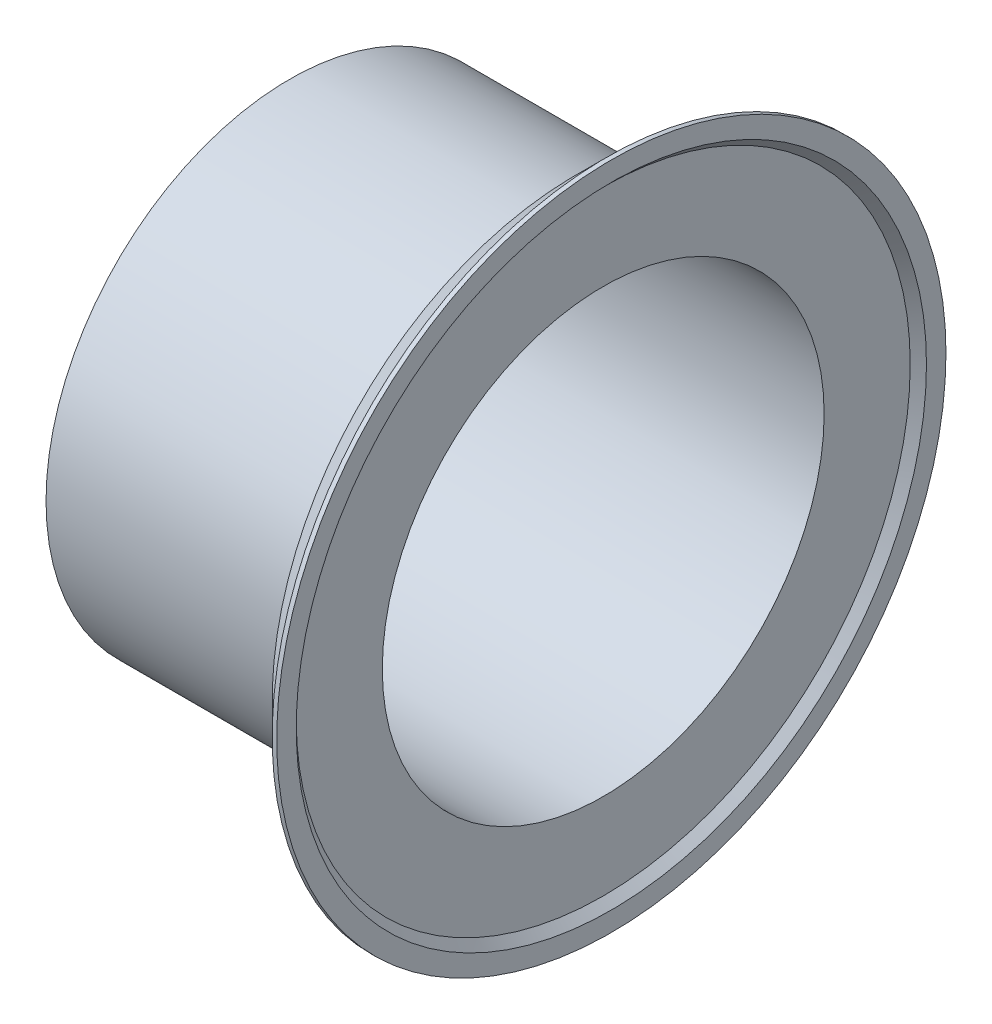
ISO-10303-21;
HEADER;
FILE_DESCRIPTION(('STEP AP214'),'2;1');
FILE_NAME('part.step','',(''),(''),'','','');
FILE_SCHEMA(('AUTOMOTIVE_DESIGN { 1 0 10303 214 1 1 1 1 }'));
ENDSEC;
DATA;
#1=APPLICATION_CONTEXT('core data for automotive mechanical design processes');
#2=APPLICATION_PROTOCOL_DEFINITION('international standard','automotive_design',2000,#1);
#3=PRODUCT_CONTEXT('',#1,'mechanical');
#4=PRODUCT('Part','Part','',(#3));
#5=PRODUCT_RELATED_PRODUCT_CATEGORY('part','',(#4));
#6=PRODUCT_DEFINITION_FORMATION('','',#4);
#7=PRODUCT_DEFINITION_CONTEXT('part definition',#1,'design');
#8=PRODUCT_DEFINITION('design','',#6,#7);
#9=PRODUCT_DEFINITION_SHAPE('','',#8);
#10=(LENGTH_UNIT() NAMED_UNIT(*) SI_UNIT(.MILLI.,.METRE.));
#11=(NAMED_UNIT(*) PLANE_ANGLE_UNIT() SI_UNIT($,.RADIAN.));
#12=(NAMED_UNIT(*) SI_UNIT($,.STERADIAN.) SOLID_ANGLE_UNIT());
#13=UNCERTAINTY_MEASURE_WITH_UNIT(LENGTH_MEASURE(1.E-05),#10,'distance_accuracy_value','');
#14=(GEOMETRIC_REPRESENTATION_CONTEXT(3) GLOBAL_UNCERTAINTY_ASSIGNED_CONTEXT((#13)) GLOBAL_UNIT_ASSIGNED_CONTEXT((#10,
#11,#12)) REPRESENTATION_CONTEXT('',''));
#15=CARTESIAN_POINT('',(0.,0.,0.));
#16=DIRECTION('',(0.,0.,1.));
#17=DIRECTION('',(1.,0.,0.));
#18=AXIS2_PLACEMENT_3D('',#15,#16,#17);
#19=CARTESIAN_POINT('',(63.1952,0.,0.));
#20=DIRECTION('',(1.,0.,0.));
#21=DIRECTION('',(0.,0.,-1.));
#22=AXIS2_PLACEMENT_3D('',#19,#20,#21);
#23=CONICAL_SURFACE('',#22,13.081,0.78539816339744);
#24=CARTESIAN_POINT('',(61.976,0.,0.));
#25=DIRECTION('',(1.,0.,0.));
#26=DIRECTION('',(0.,0.,-1.));
#27=AXIS2_PLACEMENT_3D('',#24,#25,#26);
#28=CIRCLE('',#27,11.8618);
#29=CARTESIAN_POINT('',(61.976,0.,-11.8618));
#30=VERTEX_POINT('',#29);
#31=EDGE_CURVE('E11',#30,#30,#28,.T.);
#32=ORIENTED_EDGE('',*,*,#31,.T.);
#33=EDGE_LOOP('',(#32));
#34=FACE_BOUND('',#33,.T.);
#35=CARTESIAN_POINT('',(63.1952,0.,0.));
#36=DIRECTION('',(1.,0.,0.));
#37=DIRECTION('',(0.,0.,-1.));
#38=AXIS2_PLACEMENT_3D('',#35,#36,#37);
#39=CIRCLE('',#38,13.081);
#40=CARTESIAN_POINT('',(63.1952,0.,-13.081));
#41=VERTEX_POINT('',#40);
#42=EDGE_CURVE('E73',#41,#41,#39,.T.);
#43=ORIENTED_EDGE('',*,*,#42,.F.);
#44=EDGE_LOOP('',(#43));
#45=FACE_BOUND('',#44,.T.);
#46=ADVANCED_FACE('F16',(#34,#45),#23,.T.);
#47=CARTESIAN_POINT('',(61.976,10.287,0.));
#48=DIRECTION('',(-1.,0.,0.));
#49=DIRECTION('',(0.,1.,0.));
#50=AXIS2_PLACEMENT_3D('',#47,#48,#49);
#51=PLANE('',#50);
#52=CARTESIAN_POINT('',(61.976,0.,0.));
#53=DIRECTION('',(1.,0.,0.));
#54=DIRECTION('',(0.,0.,-1.));
#55=AXIS2_PLACEMENT_3D('',#52,#53,#54);
#56=CIRCLE('',#55,10.287);
#57=CARTESIAN_POINT('',(61.976,0.,-10.287));
#58=VERTEX_POINT('',#57);
#59=EDGE_CURVE('E68',#58,#58,#56,.T.);
#60=ORIENTED_EDGE('',*,*,#59,.T.);
#61=EDGE_LOOP('',(#60));
#62=FACE_BOUND('',#61,.T.);
#63=ORIENTED_EDGE('',*,*,#31,.F.);
#64=EDGE_LOOP('',(#63));
#65=FACE_BOUND('',#64,.T.);
#66=ADVANCED_FACE('F69',(#62,#65),#51,.T.);
#67=CARTESIAN_POINT('',(63.373,13.081,0.));
#68=DIRECTION('',(1.,0.,0.));
#69=DIRECTION('',(0.,0.,1.));
#70=AXIS2_PLACEMENT_3D('',#67,#68,#69);
#71=PLANE('',#70);
#72=CARTESIAN_POINT('',(63.373,0.,0.));
#73=DIRECTION('',(1.,0.,0.));
#74=DIRECTION('',(0.,0.,-1.));
#75=AXIS2_PLACEMENT_3D('',#72,#73,#74);
#76=CIRCLE('',#75,12.319);
#77=CARTESIAN_POINT('',(63.373,0.,-12.319));
#78=VERTEX_POINT('',#77);
#79=EDGE_CURVE('E88',#78,#78,#76,.T.);
#80=ORIENTED_EDGE('',*,*,#79,.F.);
#81=EDGE_LOOP('',(#80));
#82=FACE_BOUND('',#81,.T.);
#83=CARTESIAN_POINT('',(63.373,0.,0.));
#84=DIRECTION('',(1.,0.,0.));
#85=DIRECTION('',(0.,0.,-1.));
#86=AXIS2_PLACEMENT_3D('',#83,#84,#85);
#87=CIRCLE('',#86,13.081);
#88=CARTESIAN_POINT('',(63.373,0.,-13.081));
#89=VERTEX_POINT('',#88);
#90=EDGE_CURVE('E24',#89,#89,#87,.T.);
#91=ORIENTED_EDGE('',*,*,#90,.T.);
#92=EDGE_LOOP('',(#91));
#93=FACE_BOUND('',#92,.T.);
#94=ADVANCED_FACE('F105',(#82,#93),#71,.T.);
#95=CARTESIAN_POINT('',(63.0555,12.0015,0.));
#96=DIRECTION('',(1.,0.,0.));
#97=DIRECTION('',(0.,0.,1.));
#98=AXIS2_PLACEMENT_3D('',#95,#96,#97);
#99=PLANE('',#98);
#100=CARTESIAN_POINT('',(63.0555,0.,0.));
#101=DIRECTION('',(1.,0.,0.));
#102=DIRECTION('',(0.,0.,-1.));
#103=AXIS2_PLACEMENT_3D('',#100,#101,#102);
#104=CIRCLE('',#103,8.636);
#105=CARTESIAN_POINT('',(63.0555,0.,-8.636));
#106=VERTEX_POINT('',#105);
#107=EDGE_CURVE('E140',#106,#106,#104,.T.);
#108=ORIENTED_EDGE('',*,*,#107,.F.);
#109=EDGE_LOOP('',(#108));
#110=FACE_BOUND('',#109,.T.);
#111=CARTESIAN_POINT('',(63.0555,0.,0.));
#112=DIRECTION('',(1.,0.,0.));
#113=DIRECTION('',(0.,0.,-1.));
#114=AXIS2_PLACEMENT_3D('',#111,#112,#113);
#115=CIRCLE('',#114,12.0015);
#116=CARTESIAN_POINT('',(63.0555,0.,-12.0015));
#117=VERTEX_POINT('',#116);
#118=EDGE_CURVE('E82',#117,#117,#115,.T.);
#119=ORIENTED_EDGE('',*,*,#118,.T.);
#120=EDGE_LOOP('',(#119));
#121=FACE_BOUND('',#120,.T.);
#122=ADVANCED_FACE('F95',(#110,#121),#99,.T.);
#123=CARTESIAN_POINT('',(85.7394237430291,0.,0.));
#124=DIRECTION('',(-1.,0.,0.));
#125=DIRECTION('',(0.,0.,-1.));
#126=AXIS2_PLACEMENT_3D('',#123,#124,#125);
#127=CYLINDRICAL_SURFACE('',#126,13.081);
#128=ORIENTED_EDGE('',*,*,#90,.F.);
#129=EDGE_LOOP('',(#128));
#130=FACE_BOUND('',#129,.T.);
#131=ORIENTED_EDGE('',*,*,#42,.T.);
#132=EDGE_LOOP('',(#131));
#133=FACE_BOUND('',#132,.T.);
#134=ADVANCED_FACE('F114',(#130,#133),#127,.T.);
#135=CARTESIAN_POINT('',(61.214,0.,0.));
#136=DIRECTION('',(1.,0.,0.));
#137=DIRECTION('',(0.,0.,-1.));
#138=AXIS2_PLACEMENT_3D('',#135,#136,#137);
#139=TOROIDAL_SURFACE('',#138,10.287,0.762);
#140=CARTESIAN_POINT('',(61.214,0.,0.));
#141=DIRECTION('',(1.,0.,0.));
#142=DIRECTION('',(0.,0.,-1.));
#143=AXIS2_PLACEMENT_3D('',#140,#141,#142);
#144=CIRCLE('',#143,9.525);
#145=CARTESIAN_POINT('',(61.214,0.,-9.525));
#146=VERTEX_POINT('',#145);
#147=EDGE_CURVE('E74',#146,#146,#144,.T.);
#148=ORIENTED_EDGE('',*,*,#147,.T.);
#149=EDGE_LOOP('',(#148));
#150=FACE_BOUND('',#149,.T.);
#151=ORIENTED_EDGE('',*,*,#59,.F.);
#152=EDGE_LOOP('',(#151));
#153=FACE_BOUND('',#152,.T.);
#154=ADVANCED_FACE('F127',(#150,#153),#139,.F.);
#155=CARTESIAN_POINT('',(85.7394237430291,0.,0.));
#156=DIRECTION('',(-1.,0.,0.));
#157=DIRECTION('',(0.,0.,-1.));
#158=AXIS2_PLACEMENT_3D('',#155,#156,#157);
#159=CYLINDRICAL_SURFACE('',#158,9.525);
#160=ORIENTED_EDGE('',*,*,#147,.F.);
#161=EDGE_LOOP('',(#160));
#162=FACE_BOUND('',#161,.T.);
#163=CARTESIAN_POINT('',(50.8,0.,0.));
#164=DIRECTION('',(1.,0.,0.));
#165=DIRECTION('',(0.,0.,-1.));
#166=AXIS2_PLACEMENT_3D('',#163,#164,#165);
#167=CIRCLE('',#166,9.525);
#168=CARTESIAN_POINT('',(50.8,0.,-9.525));
#169=VERTEX_POINT('',#168);
#170=EDGE_CURVE('E86',#169,#169,#167,.T.);
#171=ORIENTED_EDGE('',*,*,#170,.T.);
#172=EDGE_LOOP('',(#171));
#173=FACE_BOUND('',#172,.T.);
#174=ADVANCED_FACE('F101',(#162,#173),#159,.T.);
#175=CARTESIAN_POINT('',(63.0555,0.,0.));
#176=DIRECTION('',(1.,0.,0.));
#177=DIRECTION('',(0.,0.,-1.));
#178=AXIS2_PLACEMENT_3D('',#175,#176,#177);
#179=CONICAL_SURFACE('',#178,12.0015,0.785398163397443);
#180=ORIENTED_EDGE('',*,*,#118,.F.);
#181=EDGE_LOOP('',(#180));
#182=FACE_BOUND('',#181,.T.);
#183=ORIENTED_EDGE('',*,*,#79,.T.);
#184=EDGE_LOOP('',(#183));
#185=FACE_BOUND('',#184,.T.);
#186=ADVANCED_FACE('F97',(#182,#185),#179,.F.);
#187=CARTESIAN_POINT('',(50.8,8.636,0.));
#188=DIRECTION('',(-1.,0.,0.));
#189=DIRECTION('',(0.,1.,0.));
#190=AXIS2_PLACEMENT_3D('',#187,#188,#189);
#191=PLANE('',#190);
#192=CARTESIAN_POINT('',(50.8,0.,0.));
#193=DIRECTION('',(1.,0.,0.));
#194=DIRECTION('',(0.,0.,-1.));
#195=AXIS2_PLACEMENT_3D('',#192,#193,#194);
#196=CIRCLE('',#195,8.636);
#197=CARTESIAN_POINT('',(50.8,0.,-8.636));
#198=VERTEX_POINT('',#197);
#199=EDGE_CURVE('E143',#198,#198,#196,.T.);
#200=ORIENTED_EDGE('',*,*,#199,.T.);
#201=EDGE_LOOP('',(#200));
#202=FACE_BOUND('',#201,.T.);
#203=ORIENTED_EDGE('',*,*,#170,.F.);
#204=EDGE_LOOP('',(#203));
#205=FACE_BOUND('',#204,.T.);
#206=ADVANCED_FACE('F100',(#202,#205),#191,.T.);
#207=CARTESIAN_POINT('',(85.7394237430291,0.,0.));
#208=DIRECTION('',(-1.,0.,0.));
#209=DIRECTION('',(0.,0.,-1.));
#210=AXIS2_PLACEMENT_3D('',#207,#208,#209);
#211=CYLINDRICAL_SURFACE('',#210,8.636);
#212=ORIENTED_EDGE('',*,*,#107,.T.);
#213=EDGE_LOOP('',(#212));
#214=FACE_BOUND('',#213,.T.);
#215=ORIENTED_EDGE('',*,*,#199,.F.);
#216=EDGE_LOOP('',(#215));
#217=FACE_BOUND('',#216,.T.);
#218=ADVANCED_FACE('F154',(#214,#217),#211,.F.);
#219=CLOSED_SHELL('',(#46,#66,#94,#122,#134,#154,#174,#186,#206,#218));
#220=MANIFOLD_SOLID_BREP('B1',#219);
#221=ADVANCED_BREP_SHAPE_REPRESENTATION('',(#18,#220),#14);
#222=SHAPE_DEFINITION_REPRESENTATION(#9,#221);
ENDSEC;
END-ISO-10303-21;
